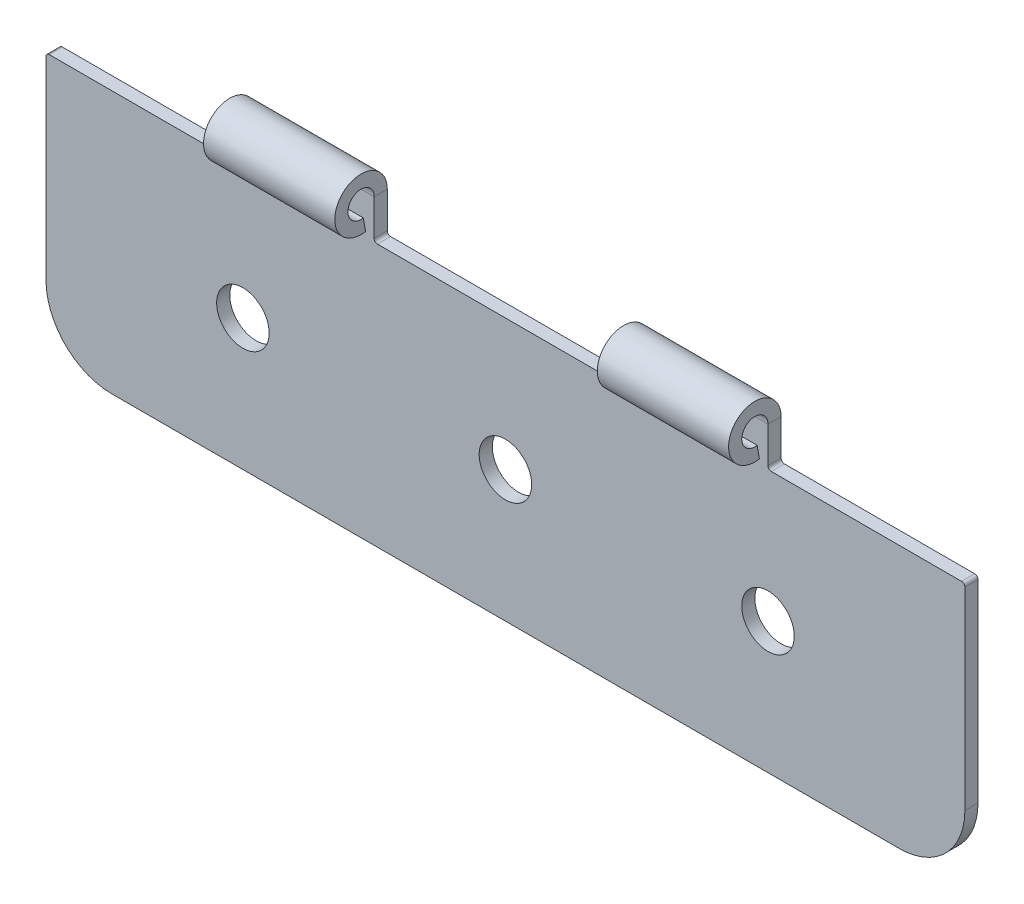
ISO-10303-21;
HEADER;
FILE_DESCRIPTION(('STEP AP214'),'2;1');
FILE_NAME('part.step','',(''),(''),'','','');
FILE_SCHEMA(('AUTOMOTIVE_DESIGN { 1 0 10303 214 1 1 1 1 }'));
ENDSEC;
DATA;
#1=APPLICATION_CONTEXT('core data for automotive mechanical design processes');
#2=APPLICATION_PROTOCOL_DEFINITION('international standard','automotive_design',2000,#1);
#3=PRODUCT_CONTEXT('',#1,'mechanical');
#4=PRODUCT('Part','Part','',(#3));
#5=PRODUCT_RELATED_PRODUCT_CATEGORY('part','',(#4));
#6=PRODUCT_DEFINITION_FORMATION('','',#4);
#7=PRODUCT_DEFINITION_CONTEXT('part definition',#1,'design');
#8=PRODUCT_DEFINITION('design','',#6,#7);
#9=PRODUCT_DEFINITION_SHAPE('','',#8);
#10=(LENGTH_UNIT() NAMED_UNIT(*) SI_UNIT(.MILLI.,.METRE.));
#11=(NAMED_UNIT(*) PLANE_ANGLE_UNIT() SI_UNIT($,.RADIAN.));
#12=(NAMED_UNIT(*) SI_UNIT($,.STERADIAN.) SOLID_ANGLE_UNIT());
#13=UNCERTAINTY_MEASURE_WITH_UNIT(LENGTH_MEASURE(1.E-05),#10,'distance_accuracy_value','');
#14=(GEOMETRIC_REPRESENTATION_CONTEXT(3) GLOBAL_UNCERTAINTY_ASSIGNED_CONTEXT((#13)) GLOBAL_UNIT_ASSIGNED_CONTEXT((#10,
#11,#12)) REPRESENTATION_CONTEXT('',''));
#15=CARTESIAN_POINT('',(0.,0.,0.));
#16=DIRECTION('',(0.,0.,1.));
#17=DIRECTION('',(1.,0.,0.));
#18=AXIS2_PLACEMENT_3D('',#15,#16,#17);
#19=CARTESIAN_POINT('',(0.,0.,-1.));
#20=DIRECTION('',(0.,0.,-1.));
#21=DIRECTION('',(-1.,0.,0.));
#22=AXIS2_PLACEMENT_3D('',#19,#20,#21);
#23=PLANE('',#22);
#24=CARTESIAN_POINT('',(15.,10.,-1.));
#25=DIRECTION('',(0.,0.,1.));
#26=DIRECTION('',(1.,0.,0.));
#27=AXIS2_PLACEMENT_3D('',#24,#25,#26);
#28=CIRCLE('',#27,2.);
#29=CARTESIAN_POINT('',(17.,10.,-1.));
#30=VERTEX_POINT('',#29);
#31=EDGE_CURVE('E820',#30,#30,#28,.T.);
#32=ORIENTED_EDGE('',*,*,#31,.T.);
#33=EDGE_LOOP('',(#32));
#34=FACE_BOUND('',#33,.T.);
#35=CARTESIAN_POINT('',(35.,10.,-1.));
#36=DIRECTION('',(0.,0.,1.));
#37=DIRECTION('',(1.,0.,0.));
#38=AXIS2_PLACEMENT_3D('',#35,#36,#37);
#39=CIRCLE('',#38,2.);
#40=CARTESIAN_POINT('',(37.,10.,-1.));
#41=VERTEX_POINT('',#40);
#42=EDGE_CURVE('E813',#41,#41,#39,.T.);
#43=ORIENTED_EDGE('',*,*,#42,.T.);
#44=EDGE_LOOP('',(#43));
#45=FACE_BOUND('',#44,.T.);
#46=DIRECTION('',(-1.,0.,0.));
#47=VECTOR('',#46,1.);
#48=CARTESIAN_POINT('',(55.,20.,-1.));
#49=LINE('',#48,#47);
#50=CARTESIAN_POINT('',(69.75,20.,-1.));
#51=VERTEX_POINT('',#50);
#52=CARTESIAN_POINT('',(55.25,20.,-1.));
#53=VERTEX_POINT('',#52);
#54=EDGE_CURVE('E204',#51,#53,#49,.T.);
#55=ORIENTED_EDGE('',*,*,#54,.F.);
#56=CARTESIAN_POINT('',(69.75,19.75,-1.));
#57=DIRECTION('',(0.,0.,-1.));
#58=DIRECTION('',(-1.,0.,0.));
#59=AXIS2_PLACEMENT_3D('',#56,#57,#58);
#60=CIRCLE('',#59,0.25);
#61=CARTESIAN_POINT('',(70.,19.75,-1.));
#62=VERTEX_POINT('',#61);
#63=EDGE_CURVE('E365',#51,#62,#60,.T.);
#64=ORIENTED_EDGE('',*,*,#63,.T.);
#65=DIRECTION('',(0.,1.,0.));
#66=VECTOR('',#65,1.);
#67=CARTESIAN_POINT('',(70.,20.,-1.));
#68=LINE('',#67,#66);
#69=CARTESIAN_POINT('',(70.,5.,-1.));
#70=VERTEX_POINT('',#69);
#71=EDGE_CURVE('E287',#70,#62,#68,.T.);
#72=ORIENTED_EDGE('',*,*,#71,.F.);
#73=CARTESIAN_POINT('',(65.,5.,-1.));
#74=DIRECTION('',(0.,0.,-1.));
#75=DIRECTION('',(-1.,0.,0.));
#76=AXIS2_PLACEMENT_3D('',#73,#74,#75);
#77=CIRCLE('',#76,5.);
#78=CARTESIAN_POINT('',(65.,0.,-1.));
#79=VERTEX_POINT('',#78);
#80=EDGE_CURVE('E344',#70,#79,#77,.T.);
#81=ORIENTED_EDGE('',*,*,#80,.T.);
#82=DIRECTION('',(1.,0.,0.));
#83=VECTOR('',#82,1.);
#84=CARTESIAN_POINT('',(70.,0.,-1.));
#85=LINE('',#84,#83);
#86=CARTESIAN_POINT('',(5.,0.,-1.));
#87=VERTEX_POINT('',#86);
#88=EDGE_CURVE('E284',#87,#79,#85,.T.);
#89=ORIENTED_EDGE('',*,*,#88,.F.);
#90=CARTESIAN_POINT('',(5.,5.,-1.));
#91=DIRECTION('',(0.,0.,-1.));
#92=DIRECTION('',(-1.,0.,0.));
#93=AXIS2_PLACEMENT_3D('',#90,#91,#92);
#94=CIRCLE('',#93,5.);
#95=CARTESIAN_POINT('',(0.,5.,-1.));
#96=VERTEX_POINT('',#95);
#97=EDGE_CURVE('E346',#87,#96,#94,.T.);
#98=ORIENTED_EDGE('',*,*,#97,.T.);
#99=DIRECTION('',(0.,-1.,0.));
#100=VECTOR('',#99,1.);
#101=CARTESIAN_POINT('',(0.,0.,-1.));
#102=LINE('',#101,#100);
#103=CARTESIAN_POINT('',(0.,19.75,-1.));
#104=VERTEX_POINT('',#103);
#105=EDGE_CURVE('E305',#104,#96,#102,.T.);
#106=ORIENTED_EDGE('',*,*,#105,.F.);
#107=CARTESIAN_POINT('',(0.25,19.75,-1.));
#108=DIRECTION('',(0.,0.,-1.));
#109=DIRECTION('',(-1.,0.,0.));
#110=AXIS2_PLACEMENT_3D('',#107,#108,#109);
#111=CIRCLE('',#110,0.25);
#112=CARTESIAN_POINT('',(0.25,20.,-1.));
#113=VERTEX_POINT('',#112);
#114=EDGE_CURVE('E363',#104,#113,#111,.T.);
#115=ORIENTED_EDGE('',*,*,#114,.T.);
#116=DIRECTION('',(-1.,0.,0.));
#117=VECTOR('',#116,1.);
#118=CARTESIAN_POINT('',(0.,20.,-1.));
#119=LINE('',#118,#117);
#120=CARTESIAN_POINT('',(14.75,20.,-1.));
#121=VERTEX_POINT('',#120);
#122=EDGE_CURVE('E302',#121,#113,#119,.T.);
#123=ORIENTED_EDGE('',*,*,#122,.F.);
#124=CARTESIAN_POINT('',(14.75,20.25,-1.));
#125=DIRECTION('',(0.,0.,-1.));
#126=DIRECTION('',(-1.,0.,0.));
#127=AXIS2_PLACEMENT_3D('',#124,#125,#126);
#128=CIRCLE('',#127,0.25);
#129=CARTESIAN_POINT('',(15.,20.25,-1.));
#130=VERTEX_POINT('',#129);
#131=EDGE_CURVE('E11',#121,#130,#128,.F.);
#132=ORIENTED_EDGE('',*,*,#131,.T.);
#133=DIRECTION('',(0.,-1.,0.));
#134=VECTOR('',#133,1.);
#135=CARTESIAN_POINT('',(15.,20.,-1.));
#136=LINE('',#135,#134);
#137=CARTESIAN_POINT('',(15.,23.,-1.));
#138=VERTEX_POINT('',#137);
#139=EDGE_CURVE('E299',#138,#130,#136,.T.);
#140=ORIENTED_EDGE('',*,*,#139,.F.);
#141=DIRECTION('',(-1.,0.,0.));
#142=VECTOR('',#141,1.);
#143=CARTESIAN_POINT('',(15.,23.,-1.));
#144=LINE('',#143,#142);
#145=CARTESIAN_POINT('',(25.,23.,-1.));
#146=VERTEX_POINT('',#145);
#147=EDGE_CURVE('E251',#138,#146,#144,.F.);
#148=ORIENTED_EDGE('',*,*,#147,.T.);
#149=DIRECTION('',(0.,1.,0.));
#150=VECTOR('',#149,1.);
#151=CARTESIAN_POINT('',(25.,25.,-1.));
#152=LINE('',#151,#150);
#153=CARTESIAN_POINT('',(25.,20.25,-1.));
#154=VERTEX_POINT('',#153);
#155=EDGE_CURVE('E297',#154,#146,#152,.T.);
#156=ORIENTED_EDGE('',*,*,#155,.F.);
#157=CARTESIAN_POINT('',(25.25,20.25,-1.));
#158=DIRECTION('',(0.,0.,-1.));
#159=DIRECTION('',(-1.,0.,0.));
#160=AXIS2_PLACEMENT_3D('',#157,#158,#159);
#161=CIRCLE('',#160,0.25);
#162=CARTESIAN_POINT('',(25.25,20.,-1.));
#163=VERTEX_POINT('',#162);
#164=EDGE_CURVE('E394',#154,#163,#161,.F.);
#165=ORIENTED_EDGE('',*,*,#164,.T.);
#166=DIRECTION('',(-1.,0.,0.));
#167=VECTOR('',#166,1.);
#168=CARTESIAN_POINT('',(25.,20.,-1.));
#169=LINE('',#168,#167);
#170=CARTESIAN_POINT('',(44.75,20.,-1.));
#171=VERTEX_POINT('',#170);
#172=EDGE_CURVE('E294',#171,#163,#169,.T.);
#173=ORIENTED_EDGE('',*,*,#172,.F.);
#174=CARTESIAN_POINT('',(44.75,20.25,-1.));
#175=DIRECTION('',(0.,0.,-1.));
#176=DIRECTION('',(-1.,0.,0.));
#177=AXIS2_PLACEMENT_3D('',#174,#175,#176);
#178=CIRCLE('',#177,0.25);
#179=CARTESIAN_POINT('',(45.,20.25,-1.));
#180=VERTEX_POINT('',#179);
#181=EDGE_CURVE('E59',#171,#180,#178,.F.);
#182=ORIENTED_EDGE('',*,*,#181,.T.);
#183=DIRECTION('',(0.,-1.,0.));
#184=VECTOR('',#183,1.);
#185=CARTESIAN_POINT('',(45.,20.,-1.));
#186=LINE('',#185,#184);
#187=CARTESIAN_POINT('',(45.,23.,-1.));
#188=VERTEX_POINT('',#187);
#189=EDGE_CURVE('E203',#188,#180,#186,.T.);
#190=ORIENTED_EDGE('',*,*,#189,.F.);
#191=DIRECTION('',(-1.,0.,0.));
#192=VECTOR('',#191,1.);
#193=CARTESIAN_POINT('',(45.,23.,-1.));
#194=LINE('',#193,#192);
#195=CARTESIAN_POINT('',(55.,23.,-1.));
#196=VERTEX_POINT('',#195);
#197=EDGE_CURVE('E221',#188,#196,#194,.F.);
#198=ORIENTED_EDGE('',*,*,#197,.T.);
#199=DIRECTION('',(0.,1.,0.));
#200=VECTOR('',#199,1.);
#201=CARTESIAN_POINT('',(55.,25.,-1.));
#202=LINE('',#201,#200);
#203=CARTESIAN_POINT('',(55.,20.25,-1.));
#204=VERTEX_POINT('',#203);
#205=EDGE_CURVE('E197',#204,#196,#202,.T.);
#206=ORIENTED_EDGE('',*,*,#205,.F.);
#207=CARTESIAN_POINT('',(55.25,20.25,-1.));
#208=DIRECTION('',(0.,0.,-1.));
#209=DIRECTION('',(-1.,0.,0.));
#210=AXIS2_PLACEMENT_3D('',#207,#208,#209);
#211=CIRCLE('',#210,0.25);
#212=EDGE_CURVE('E390',#204,#53,#211,.F.);
#213=ORIENTED_EDGE('',*,*,#212,.T.);
#214=EDGE_LOOP('',(#55,#64,#72,#81,#89,#98,#106,#115,#123,#132,#140,#148,#156,#165,#173,#182,
#190,#198,#206,#213));
#215=FACE_BOUND('',#214,.T.);
#216=CARTESIAN_POINT('',(55.,10.,-1.));
#217=DIRECTION('',(0.,0.,1.));
#218=DIRECTION('',(1.,0.,0.));
#219=AXIS2_PLACEMENT_3D('',#216,#217,#218);
#220=CIRCLE('',#219,2.);
#221=CARTESIAN_POINT('',(57.,10.,-1.));
#222=VERTEX_POINT('',#221);
#223=EDGE_CURVE('E232',#222,#222,#220,.T.);
#224=ORIENTED_EDGE('',*,*,#223,.T.);
#225=EDGE_LOOP('',(#224));
#226=FACE_BOUND('',#225,.T.);
#227=ADVANCED_FACE('F36',(#34,#45,#215,#226),#23,.T.);
#228=CARTESIAN_POINT('',(45.,20.,-1.));
#229=DIRECTION('',(-1.,0.,0.));
#230=DIRECTION('',(0.,0.,1.));
#231=AXIS2_PLACEMENT_3D('',#228,#229,#230);
#232=PLANE('',#231);
#233=ORIENTED_EDGE('',*,*,#189,.T.);
#234=DIRECTION('',(0.,0.,1.));
#235=VECTOR('',#234,1.);
#236=CARTESIAN_POINT('',(45.,20.25,0.));
#237=LINE('',#236,#235);
#238=CARTESIAN_POINT('',(45.,20.25,0.));
#239=VERTEX_POINT('',#238);
#240=EDGE_CURVE('E375',#180,#239,#237,.T.);
#241=ORIENTED_EDGE('',*,*,#240,.T.);
#242=DIRECTION('',(0.,-1.,0.));
#243=VECTOR('',#242,1.);
#244=CARTESIAN_POINT('',(45.,20.,0.));
#245=LINE('',#244,#243);
#246=CARTESIAN_POINT('',(45.,23.,0.));
#247=VERTEX_POINT('',#246);
#248=EDGE_CURVE('E318',#247,#239,#245,.T.);
#249=ORIENTED_EDGE('',*,*,#248,.F.);
#250=DIRECTION('',(0.,0.,-1.));
#251=VECTOR('',#250,1.);
#252=CARTESIAN_POINT('',(45.,23.,0.));
#253=LINE('',#252,#251);
#254=EDGE_CURVE('E215',#247,#188,#253,.T.);
#255=ORIENTED_EDGE('',*,*,#254,.T.);
#256=EDGE_LOOP('',(#233,#241,#249,#255));
#257=FACE_BOUND('',#256,.T.);
#258=ADVANCED_FACE('F447',(#257),#232,.T.);
#259=CARTESIAN_POINT('',(15.,20.,-1.));
#260=DIRECTION('',(-1.,0.,0.));
#261=DIRECTION('',(0.,0.,1.));
#262=AXIS2_PLACEMENT_3D('',#259,#260,#261);
#263=PLANE('',#262);
#264=ORIENTED_EDGE('',*,*,#139,.T.);
#265=DIRECTION('',(0.,0.,1.));
#266=VECTOR('',#265,1.);
#267=CARTESIAN_POINT('',(15.,20.25,0.));
#268=LINE('',#267,#266);
#269=CARTESIAN_POINT('',(15.,20.25,0.));
#270=VERTEX_POINT('',#269);
#271=EDGE_CURVE('E378',#130,#270,#268,.T.);
#272=ORIENTED_EDGE('',*,*,#271,.T.);
#273=DIRECTION('',(0.,-1.,0.));
#274=VECTOR('',#273,1.);
#275=CARTESIAN_POINT('',(15.,20.,0.));
#276=LINE('',#275,#274);
#277=CARTESIAN_POINT('',(15.,23.,0.));
#278=VERTEX_POINT('',#277);
#279=EDGE_CURVE('E326',#278,#270,#276,.T.);
#280=ORIENTED_EDGE('',*,*,#279,.F.);
#281=DIRECTION('',(0.,0.,-1.));
#282=VECTOR('',#281,1.);
#283=CARTESIAN_POINT('',(15.,23.,0.));
#284=LINE('',#283,#282);
#285=EDGE_CURVE('E258',#278,#138,#284,.T.);
#286=ORIENTED_EDGE('',*,*,#285,.T.);
#287=EDGE_LOOP('',(#264,#272,#280,#286));
#288=FACE_BOUND('',#287,.T.);
#289=ADVANCED_FACE('F414',(#288),#263,.T.);
#290=CARTESIAN_POINT('',(70.,0.,-1.));
#291=DIRECTION('',(0.,-1.,0.));
#292=DIRECTION('',(1.,0.,0.));
#293=AXIS2_PLACEMENT_3D('',#290,#291,#292);
#294=PLANE('',#293);
#295=DIRECTION('',(1.,0.,0.));
#296=VECTOR('',#295,1.);
#297=CARTESIAN_POINT('',(70.,0.,0.));
#298=LINE('',#297,#296);
#299=CARTESIAN_POINT('',(5.,0.,0.));
#300=VERTEX_POINT('',#299);
#301=CARTESIAN_POINT('',(65.,0.,0.));
#302=VERTEX_POINT('',#301);
#303=EDGE_CURVE('E281',#300,#302,#298,.T.);
#304=ORIENTED_EDGE('',*,*,#303,.F.);
#305=DIRECTION('',(0.,0.,1.));
#306=VECTOR('',#305,1.);
#307=CARTESIAN_POINT('',(5.,0.,-1.));
#308=LINE('',#307,#306);
#309=EDGE_CURVE('E342',#300,#87,#308,.F.);
#310=ORIENTED_EDGE('',*,*,#309,.T.);
#311=ORIENTED_EDGE('',*,*,#88,.T.);
#312=DIRECTION('',(0.,0.,1.));
#313=VECTOR('',#312,1.);
#314=CARTESIAN_POINT('',(65.,0.,-1.));
#315=LINE('',#314,#313);
#316=EDGE_CURVE('E339',#79,#302,#315,.T.);
#317=ORIENTED_EDGE('',*,*,#316,.T.);
#318=EDGE_LOOP('',(#304,#310,#311,#317));
#319=FACE_BOUND('',#318,.T.);
#320=ADVANCED_FACE('F487',(#319),#294,.T.);
#321=CARTESIAN_POINT('',(0.,0.,-1.));
#322=DIRECTION('',(-1.,0.,0.));
#323=DIRECTION('',(0.,0.,1.));
#324=AXIS2_PLACEMENT_3D('',#321,#322,#323);
#325=PLANE('',#324);
#326=DIRECTION('',(0.,-1.,0.));
#327=VECTOR('',#326,1.);
#328=CARTESIAN_POINT('',(0.,0.,0.));
#329=LINE('',#328,#327);
#330=CARTESIAN_POINT('',(0.,19.75,0.));
#331=VERTEX_POINT('',#330);
#332=CARTESIAN_POINT('',(0.,5.,0.));
#333=VERTEX_POINT('',#332);
#334=EDGE_CURVE('E288',#331,#333,#329,.T.);
#335=ORIENTED_EDGE('',*,*,#334,.F.);
#336=DIRECTION('',(0.,0.,1.));
#337=VECTOR('',#336,1.);
#338=CARTESIAN_POINT('',(0.,19.75,-1.));
#339=LINE('',#338,#337);
#340=EDGE_CURVE('E386',#331,#104,#339,.F.);
#341=ORIENTED_EDGE('',*,*,#340,.T.);
#342=ORIENTED_EDGE('',*,*,#105,.T.);
#343=DIRECTION('',(0.,0.,1.));
#344=VECTOR('',#343,1.);
#345=CARTESIAN_POINT('',(0.,5.,-1.));
#346=LINE('',#345,#344);
#347=EDGE_CURVE('E307',#96,#333,#346,.T.);
#348=ORIENTED_EDGE('',*,*,#347,.T.);
#349=EDGE_LOOP('',(#335,#341,#342,#348));
#350=FACE_BOUND('',#349,.T.);
#351=ADVANCED_FACE('F484',(#350),#325,.T.);
#352=CARTESIAN_POINT('',(0.,20.,-1.));
#353=DIRECTION('',(0.,1.,0.));
#354=DIRECTION('',(0.,0.,1.));
#355=AXIS2_PLACEMENT_3D('',#352,#353,#354);
#356=PLANE('',#355);
#357=DIRECTION('',(-1.,0.,0.));
#358=VECTOR('',#357,1.);
#359=CARTESIAN_POINT('',(0.,20.,0.));
#360=LINE('',#359,#358);
#361=CARTESIAN_POINT('',(14.75,20.,0.));
#362=VERTEX_POINT('',#361);
#363=CARTESIAN_POINT('',(0.25,20.,0.));
#364=VERTEX_POINT('',#363);
#365=EDGE_CURVE('E329',#362,#364,#360,.T.);
#366=ORIENTED_EDGE('',*,*,#365,.F.);
#367=DIRECTION('',(0.,0.,1.));
#368=VECTOR('',#367,1.);
#369=CARTESIAN_POINT('',(14.75,20.,-1.));
#370=LINE('',#369,#368);
#371=EDGE_CURVE('E384',#362,#121,#370,.F.);
#372=ORIENTED_EDGE('',*,*,#371,.T.);
#373=ORIENTED_EDGE('',*,*,#122,.T.);
#374=DIRECTION('',(0.,0.,1.));
#375=VECTOR('',#374,1.);
#376=CARTESIAN_POINT('',(0.25,20.,-1.));
#377=LINE('',#376,#375);
#378=EDGE_CURVE('E381',#113,#364,#377,.T.);
#379=ORIENTED_EDGE('',*,*,#378,.T.);
#380=EDGE_LOOP('',(#366,#372,#373,#379));
#381=FACE_BOUND('',#380,.T.);
#382=ADVANCED_FACE('F407',(#381),#356,.T.);
#383=CARTESIAN_POINT('',(25.,25.,-1.));
#384=DIRECTION('',(1.,0.,0.));
#385=DIRECTION('',(0.,0.,-1.));
#386=AXIS2_PLACEMENT_3D('',#383,#384,#385);
#387=PLANE('',#386);
#388=DIRECTION('',(0.,1.,0.));
#389=VECTOR('',#388,1.);
#390=CARTESIAN_POINT('',(25.,25.,0.));
#391=LINE('',#390,#389);
#392=CARTESIAN_POINT('',(25.,20.25,0.));
#393=VERTEX_POINT('',#392);
#394=CARTESIAN_POINT('',(25.,23.,0.));
#395=VERTEX_POINT('',#394);
#396=EDGE_CURVE('E324',#393,#395,#391,.T.);
#397=ORIENTED_EDGE('',*,*,#396,.F.);
#398=DIRECTION('',(0.,0.,1.));
#399=VECTOR('',#398,1.);
#400=CARTESIAN_POINT('',(25.,20.25,-1.));
#401=LINE('',#400,#399);
#402=EDGE_CURVE('E373',#393,#154,#401,.F.);
#403=ORIENTED_EDGE('',*,*,#402,.T.);
#404=ORIENTED_EDGE('',*,*,#155,.T.);
#405=DIRECTION('',(0.,0.,-1.));
#406=VECTOR('',#405,1.);
#407=CARTESIAN_POINT('',(25.,23.,0.));
#408=LINE('',#407,#406);
#409=EDGE_CURVE('E274',#395,#146,#408,.T.);
#410=ORIENTED_EDGE('',*,*,#409,.F.);
#411=EDGE_LOOP('',(#397,#403,#404,#410));
#412=FACE_BOUND('',#411,.T.);
#413=ADVANCED_FACE('F430',(#412),#387,.T.);
#414=CARTESIAN_POINT('',(25.,20.,-1.));
#415=DIRECTION('',(0.,1.,0.));
#416=DIRECTION('',(0.,0.,1.));
#417=AXIS2_PLACEMENT_3D('',#414,#415,#416);
#418=PLANE('',#417);
#419=ORIENTED_EDGE('',*,*,#172,.T.);
#420=DIRECTION('',(0.,0.,1.));
#421=VECTOR('',#420,1.);
#422=CARTESIAN_POINT('',(25.25,20.,0.));
#423=LINE('',#422,#421);
#424=CARTESIAN_POINT('',(25.25,20.,0.));
#425=VERTEX_POINT('',#424);
#426=EDGE_CURVE('E370',#163,#425,#423,.T.);
#427=ORIENTED_EDGE('',*,*,#426,.T.);
#428=DIRECTION('',(-1.,0.,0.));
#429=VECTOR('',#428,1.);
#430=CARTESIAN_POINT('',(25.,20.,0.));
#431=LINE('',#430,#429);
#432=CARTESIAN_POINT('',(44.75,20.,0.));
#433=VERTEX_POINT('',#432);
#434=EDGE_CURVE('E321',#433,#425,#431,.T.);
#435=ORIENTED_EDGE('',*,*,#434,.F.);
#436=DIRECTION('',(0.,0.,1.));
#437=VECTOR('',#436,1.);
#438=CARTESIAN_POINT('',(44.75,20.,-1.));
#439=LINE('',#438,#437);
#440=EDGE_CURVE('E368',#433,#171,#439,.F.);
#441=ORIENTED_EDGE('',*,*,#440,.T.);
#442=EDGE_LOOP('',(#419,#427,#435,#441));
#443=FACE_BOUND('',#442,.T.);
#444=ADVANCED_FACE('F439',(#443),#418,.T.);
#445=CARTESIAN_POINT('',(55.,25.,-1.));
#446=DIRECTION('',(1.,0.,0.));
#447=DIRECTION('',(0.,0.,-1.));
#448=AXIS2_PLACEMENT_3D('',#445,#446,#447);
#449=PLANE('',#448);
#450=DIRECTION('',(0.,1.,0.));
#451=VECTOR('',#450,1.);
#452=CARTESIAN_POINT('',(55.,25.,0.));
#453=LINE('',#452,#451);
#454=CARTESIAN_POINT('',(55.,20.25,0.));
#455=VERTEX_POINT('',#454);
#456=CARTESIAN_POINT('',(55.,23.,0.));
#457=VERTEX_POINT('',#456);
#458=EDGE_CURVE('E316',#455,#457,#453,.T.);
#459=ORIENTED_EDGE('',*,*,#458,.F.);
#460=DIRECTION('',(0.,0.,1.));
#461=VECTOR('',#460,1.);
#462=CARTESIAN_POINT('',(55.,20.25,-1.));
#463=LINE('',#462,#461);
#464=EDGE_CURVE('E51',#455,#204,#463,.F.);
#465=ORIENTED_EDGE('',*,*,#464,.T.);
#466=ORIENTED_EDGE('',*,*,#205,.T.);
#467=DIRECTION('',(0.,0.,-1.));
#468=VECTOR('',#467,1.);
#469=CARTESIAN_POINT('',(55.,23.,0.));
#470=LINE('',#469,#468);
#471=EDGE_CURVE('E200',#457,#196,#470,.T.);
#472=ORIENTED_EDGE('',*,*,#471,.F.);
#473=EDGE_LOOP('',(#459,#465,#466,#472));
#474=FACE_BOUND('',#473,.T.);
#475=ADVANCED_FACE('F199',(#474),#449,.T.);
#476=CARTESIAN_POINT('',(55.,20.,-1.));
#477=DIRECTION('',(0.,1.,0.));
#478=DIRECTION('',(-1.,0.,0.));
#479=AXIS2_PLACEMENT_3D('',#476,#477,#478);
#480=PLANE('',#479);
#481=DIRECTION('',(-1.,0.,0.));
#482=VECTOR('',#481,1.);
#483=CARTESIAN_POINT('',(55.,20.,0.));
#484=LINE('',#483,#482);
#485=CARTESIAN_POINT('',(69.75,20.,0.));
#486=VERTEX_POINT('',#485);
#487=CARTESIAN_POINT('',(55.25,20.,0.));
#488=VERTEX_POINT('',#487);
#489=EDGE_CURVE('E313',#486,#488,#484,.T.);
#490=ORIENTED_EDGE('',*,*,#489,.F.);
#491=DIRECTION('',(0.,0.,1.));
#492=VECTOR('',#491,1.);
#493=CARTESIAN_POINT('',(69.75,20.,-1.));
#494=LINE('',#493,#492);
#495=EDGE_CURVE('E361',#486,#51,#494,.F.);
#496=ORIENTED_EDGE('',*,*,#495,.T.);
#497=ORIENTED_EDGE('',*,*,#54,.T.);
#498=DIRECTION('',(0.,0.,1.));
#499=VECTOR('',#498,1.);
#500=CARTESIAN_POINT('',(55.25,20.,0.));
#501=LINE('',#500,#499);
#502=EDGE_CURVE('E358',#53,#488,#501,.T.);
#503=ORIENTED_EDGE('',*,*,#502,.T.);
#504=EDGE_LOOP('',(#490,#496,#497,#503));
#505=FACE_BOUND('',#504,.T.);
#506=ADVANCED_FACE('F499',(#505),#480,.T.);
#507=CARTESIAN_POINT('',(70.,20.,-1.));
#508=DIRECTION('',(1.,0.,0.));
#509=DIRECTION('',(0.,0.,-1.));
#510=AXIS2_PLACEMENT_3D('',#507,#508,#509);
#511=PLANE('',#510);
#512=ORIENTED_EDGE('',*,*,#71,.T.);
#513=DIRECTION('',(0.,0.,1.));
#514=VECTOR('',#513,1.);
#515=CARTESIAN_POINT('',(70.,19.75,-1.));
#516=LINE('',#515,#514);
#517=CARTESIAN_POINT('',(70.,19.75,0.));
#518=VERTEX_POINT('',#517);
#519=EDGE_CURVE('E351',#62,#518,#516,.T.);
#520=ORIENTED_EDGE('',*,*,#519,.T.);
#521=DIRECTION('',(0.,1.,0.));
#522=VECTOR('',#521,1.);
#523=CARTESIAN_POINT('',(70.,20.,0.));
#524=LINE('',#523,#522);
#525=CARTESIAN_POINT('',(70.,5.,0.));
#526=VERTEX_POINT('',#525);
#527=EDGE_CURVE('E310',#526,#518,#524,.T.);
#528=ORIENTED_EDGE('',*,*,#527,.F.);
#529=DIRECTION('',(0.,0.,1.));
#530=VECTOR('',#529,1.);
#531=CARTESIAN_POINT('',(70.,5.,-1.));
#532=LINE('',#531,#530);
#533=EDGE_CURVE('E349',#526,#70,#532,.F.);
#534=ORIENTED_EDGE('',*,*,#533,.T.);
#535=EDGE_LOOP('',(#512,#520,#528,#534));
#536=FACE_BOUND('',#535,.T.);
#537=ADVANCED_FACE('F482',(#536),#511,.T.);
#538=CARTESIAN_POINT('',(0.,0.,0.));
#539=DIRECTION('',(0.,0.,-1.));
#540=DIRECTION('',(-1.,0.,0.));
#541=AXIS2_PLACEMENT_3D('',#538,#539,#540);
#542=PLANE('',#541);
#543=CARTESIAN_POINT('',(15.,10.,0.));
#544=DIRECTION('',(0.,0.,1.));
#545=DIRECTION('',(1.,0.,0.));
#546=AXIS2_PLACEMENT_3D('',#543,#544,#545);
#547=CIRCLE('',#546,2.);
#548=CARTESIAN_POINT('',(17.,10.,0.));
#549=VERTEX_POINT('',#548);
#550=EDGE_CURVE('E822',#549,#549,#547,.T.);
#551=ORIENTED_EDGE('',*,*,#550,.F.);
#552=EDGE_LOOP('',(#551));
#553=FACE_BOUND('',#552,.T.);
#554=CARTESIAN_POINT('',(35.,10.,0.));
#555=DIRECTION('',(0.,0.,1.));
#556=DIRECTION('',(1.,0.,0.));
#557=AXIS2_PLACEMENT_3D('',#554,#555,#556);
#558=CIRCLE('',#557,2.);
#559=CARTESIAN_POINT('',(37.,10.,0.));
#560=VERTEX_POINT('',#559);
#561=EDGE_CURVE('E815',#560,#560,#558,.T.);
#562=ORIENTED_EDGE('',*,*,#561,.F.);
#563=EDGE_LOOP('',(#562));
#564=FACE_BOUND('',#563,.T.);
#565=CARTESIAN_POINT('',(55.,10.,0.));
#566=DIRECTION('',(0.,0.,1.));
#567=DIRECTION('',(1.,0.,0.));
#568=AXIS2_PLACEMENT_3D('',#565,#566,#567);
#569=CIRCLE('',#568,2.);
#570=CARTESIAN_POINT('',(57.,10.,0.));
#571=VERTEX_POINT('',#570);
#572=EDGE_CURVE('E811',#571,#571,#569,.T.);
#573=ORIENTED_EDGE('',*,*,#572,.F.);
#574=EDGE_LOOP('',(#573));
#575=FACE_BOUND('',#574,.T.);
#576=ORIENTED_EDGE('',*,*,#527,.T.);
#577=CARTESIAN_POINT('',(69.75,19.75,0.));
#578=DIRECTION('',(0.,0.,-1.));
#579=DIRECTION('',(-1.,0.,0.));
#580=AXIS2_PLACEMENT_3D('',#577,#578,#579);
#581=CIRCLE('',#580,0.25);
#582=EDGE_CURVE('E356',#518,#486,#581,.F.);
#583=ORIENTED_EDGE('',*,*,#582,.T.);
#584=ORIENTED_EDGE('',*,*,#489,.T.);
#585=CARTESIAN_POINT('',(55.25,20.25,0.));
#586=DIRECTION('',(0.,0.,-1.));
#587=DIRECTION('',(-1.,0.,0.));
#588=AXIS2_PLACEMENT_3D('',#585,#586,#587);
#589=CIRCLE('',#588,0.25);
#590=EDGE_CURVE('E388',#488,#455,#589,.T.);
#591=ORIENTED_EDGE('',*,*,#590,.T.);
#592=ORIENTED_EDGE('',*,*,#458,.T.);
#593=DIRECTION('',(-1.,0.,0.));
#594=VECTOR('',#593,1.);
#595=CARTESIAN_POINT('',(45.,23.,0.));
#596=LINE('',#595,#594);
#597=EDGE_CURVE('E237',#247,#457,#596,.F.);
#598=ORIENTED_EDGE('',*,*,#597,.F.);
#599=ORIENTED_EDGE('',*,*,#248,.T.);
#600=CARTESIAN_POINT('',(44.75,20.25,0.));
#601=DIRECTION('',(0.,0.,-1.));
#602=DIRECTION('',(-1.,0.,0.));
#603=AXIS2_PLACEMENT_3D('',#600,#601,#602);
#604=CIRCLE('',#603,0.25);
#605=EDGE_CURVE('E396',#239,#433,#604,.T.);
#606=ORIENTED_EDGE('',*,*,#605,.T.);
#607=ORIENTED_EDGE('',*,*,#434,.T.);
#608=CARTESIAN_POINT('',(25.25,20.25,0.));
#609=DIRECTION('',(0.,0.,-1.));
#610=DIRECTION('',(-1.,0.,0.));
#611=AXIS2_PLACEMENT_3D('',#608,#609,#610);
#612=CIRCLE('',#611,0.25);
#613=EDGE_CURVE('E392',#425,#393,#612,.T.);
#614=ORIENTED_EDGE('',*,*,#613,.T.);
#615=ORIENTED_EDGE('',*,*,#396,.T.);
#616=DIRECTION('',(-1.,0.,0.));
#617=VECTOR('',#616,1.);
#618=CARTESIAN_POINT('',(15.,23.,0.));
#619=LINE('',#618,#617);
#620=EDGE_CURVE('E267',#278,#395,#619,.F.);
#621=ORIENTED_EDGE('',*,*,#620,.F.);
#622=ORIENTED_EDGE('',*,*,#279,.T.);
#623=CARTESIAN_POINT('',(14.75,20.25,0.));
#624=DIRECTION('',(0.,0.,-1.));
#625=DIRECTION('',(-1.,0.,0.));
#626=AXIS2_PLACEMENT_3D('',#623,#624,#625);
#627=CIRCLE('',#626,0.25);
#628=EDGE_CURVE('E44',#270,#362,#627,.T.);
#629=ORIENTED_EDGE('',*,*,#628,.T.);
#630=ORIENTED_EDGE('',*,*,#365,.T.);
#631=CARTESIAN_POINT('',(0.25,19.75,0.));
#632=DIRECTION('',(0.,0.,-1.));
#633=DIRECTION('',(-1.,0.,0.));
#634=AXIS2_PLACEMENT_3D('',#631,#632,#633);
#635=CIRCLE('',#634,0.25);
#636=EDGE_CURVE('E354',#364,#331,#635,.F.);
#637=ORIENTED_EDGE('',*,*,#636,.T.);
#638=ORIENTED_EDGE('',*,*,#334,.T.);
#639=CARTESIAN_POINT('',(5.,5.,0.));
#640=DIRECTION('',(0.,0.,-1.));
#641=DIRECTION('',(-1.,0.,0.));
#642=AXIS2_PLACEMENT_3D('',#639,#640,#641);
#643=CIRCLE('',#642,5.);
#644=EDGE_CURVE('E337',#333,#300,#643,.F.);
#645=ORIENTED_EDGE('',*,*,#644,.T.);
#646=ORIENTED_EDGE('',*,*,#303,.T.);
#647=CARTESIAN_POINT('',(65.,5.,0.));
#648=DIRECTION('',(0.,0.,-1.));
#649=DIRECTION('',(-1.,0.,0.));
#650=AXIS2_PLACEMENT_3D('',#647,#648,#649);
#651=CIRCLE('',#650,5.);
#652=EDGE_CURVE('E335',#302,#526,#651,.F.);
#653=ORIENTED_EDGE('',*,*,#652,.T.);
#654=EDGE_LOOP('',(#576,#583,#584,#591,#592,#598,#599,#606,#607,#614,#615,#621,#622,#629,#630,
#637,#638,#645,#646,#653));
#655=FACE_BOUND('',#654,.T.);
#656=ADVANCED_FACE('F400',(#553,#564,#575,#655),#542,.F.);
#657=CARTESIAN_POINT('',(20.,22.0151922469878,0.826351822333061));
#658=DIRECTION('',(0.,-0.173648177666938,0.984807753012207));
#659=DIRECTION('',(-1.,0.,0.));
#660=AXIS2_PLACEMENT_3D('',#657,#658,#659);
#661=PLANE('',#660);
#662=DIRECTION('',(0.,-0.984807753012207,-0.173648177666938));
#663=VECTOR('',#662,1.);
#664=CARTESIAN_POINT('',(15.,22.0151922469878,0.826351822333061));
#665=LINE('',#664,#663);
#666=CARTESIAN_POINT('',(15.,22.0151922469878,0.826351822333061));
#667=VERTEX_POINT('',#666);
#668=CARTESIAN_POINT('',(15.,21.0303844939756,0.652703644666123));
#669=VERTEX_POINT('',#668);
#670=EDGE_CURVE('E279',#667,#669,#665,.T.);
#671=ORIENTED_EDGE('',*,*,#670,.F.);
#672=DIRECTION('',(-1.,0.,0.));
#673=VECTOR('',#672,1.);
#674=CARTESIAN_POINT('',(15.,22.0151922469878,0.826351822333061));
#675=LINE('',#674,#673);
#676=CARTESIAN_POINT('',(25.,22.0151922469878,0.826351822333061));
#677=VERTEX_POINT('',#676);
#678=EDGE_CURVE('E248',#677,#667,#675,.T.);
#679=ORIENTED_EDGE('',*,*,#678,.F.);
#680=DIRECTION('',(0.,-0.984807753012207,-0.173648177666938));
#681=VECTOR('',#680,1.);
#682=CARTESIAN_POINT('',(25.,22.0151922469878,0.826351822333061));
#683=LINE('',#682,#681);
#684=CARTESIAN_POINT('',(25.,21.0303844939756,0.652703644666123));
#685=VERTEX_POINT('',#684);
#686=EDGE_CURVE('E277',#677,#685,#683,.T.);
#687=ORIENTED_EDGE('',*,*,#686,.T.);
#688=DIRECTION('',(-1.,0.,0.));
#689=VECTOR('',#688,1.);
#690=CARTESIAN_POINT('',(15.,21.0303844939756,0.652703644666123));
#691=LINE('',#690,#689);
#692=EDGE_CURVE('E259',#685,#669,#691,.T.);
#693=ORIENTED_EDGE('',*,*,#692,.T.);
#694=EDGE_LOOP('',(#671,#679,#687,#693));
#695=FACE_BOUND('',#694,.T.);
#696=ADVANCED_FACE('F481',(#695),#661,.F.);
#697=CARTESIAN_POINT('',(25.,23.,1.));
#698=DIRECTION('',(1.,0.,0.));
#699=DIRECTION('',(0.,0.,-1.));
#700=AXIS2_PLACEMENT_3D('',#697,#698,#699);
#701=PLANE('',#700);
#702=ORIENTED_EDGE('',*,*,#686,.F.);
#703=CARTESIAN_POINT('',(25.,23.,1.));
#704=DIRECTION('',(-1.,0.,0.));
#705=DIRECTION('',(0.,0.,1.));
#706=AXIS2_PLACEMENT_3D('',#703,#704,#705);
#707=CIRCLE('',#706,1.);
#708=EDGE_CURVE('E262',#395,#677,#707,.F.);
#709=ORIENTED_EDGE('',*,*,#708,.F.);
#710=ORIENTED_EDGE('',*,*,#409,.T.);
#711=CARTESIAN_POINT('',(25.,23.,1.));
#712=DIRECTION('',(-1.,0.,0.));
#713=DIRECTION('',(0.,0.,1.));
#714=AXIS2_PLACEMENT_3D('',#711,#712,#713);
#715=CIRCLE('',#714,2.);
#716=EDGE_CURVE('E254',#146,#685,#715,.F.);
#717=ORIENTED_EDGE('',*,*,#716,.T.);
#718=EDGE_LOOP('',(#702,#709,#710,#717));
#719=FACE_BOUND('',#718,.T.);
#720=ADVANCED_FACE('F426',(#719),#701,.T.);
#721=CARTESIAN_POINT('',(15.,23.,1.));
#722=DIRECTION('',(1.,0.,0.));
#723=DIRECTION('',(0.,0.,-1.));
#724=AXIS2_PLACEMENT_3D('',#721,#722,#723);
#725=PLANE('',#724);
#726=CARTESIAN_POINT('',(15.,23.,1.));
#727=DIRECTION('',(-1.,0.,0.));
#728=DIRECTION('',(0.,0.,1.));
#729=AXIS2_PLACEMENT_3D('',#726,#727,#728);
#730=CIRCLE('',#729,1.);
#731=EDGE_CURVE('E270',#667,#278,#730,.T.);
#732=ORIENTED_EDGE('',*,*,#731,.F.);
#733=ORIENTED_EDGE('',*,*,#670,.T.);
#734=CARTESIAN_POINT('',(15.,23.,1.));
#735=DIRECTION('',(-1.,0.,0.));
#736=DIRECTION('',(0.,0.,1.));
#737=AXIS2_PLACEMENT_3D('',#734,#735,#736);
#738=CIRCLE('',#737,2.);
#739=EDGE_CURVE('E255',#669,#138,#738,.T.);
#740=ORIENTED_EDGE('',*,*,#739,.T.);
#741=ORIENTED_EDGE('',*,*,#285,.F.);
#742=EDGE_LOOP('',(#732,#733,#740,#741));
#743=FACE_BOUND('',#742,.T.);
#744=ADVANCED_FACE('F418',(#743),#725,.F.);
#745=CARTESIAN_POINT('',(15.,23.,1.));
#746=DIRECTION('',(-1.,0.,0.));
#747=DIRECTION('',(0.,-0.984807753012207,-0.173648177666938));
#748=AXIS2_PLACEMENT_3D('',#745,#746,#747);
#749=CYLINDRICAL_SURFACE('',#748,2.);
#750=ORIENTED_EDGE('',*,*,#147,.F.);
#751=ORIENTED_EDGE('',*,*,#739,.F.);
#752=ORIENTED_EDGE('',*,*,#692,.F.);
#753=ORIENTED_EDGE('',*,*,#716,.F.);
#754=EDGE_LOOP('',(#750,#751,#752,#753));
#755=FACE_BOUND('',#754,.T.);
#756=ADVANCED_FACE('F464',(#755),#749,.T.);
#757=CARTESIAN_POINT('',(15.,23.,1.));
#758=DIRECTION('',(-1.,0.,0.));
#759=DIRECTION('',(0.,-0.984807753012207,-0.173648177666938));
#760=AXIS2_PLACEMENT_3D('',#757,#758,#759);
#761=CYLINDRICAL_SURFACE('',#760,1.);
#762=ORIENTED_EDGE('',*,*,#620,.T.);
#763=ORIENTED_EDGE('',*,*,#708,.T.);
#764=ORIENTED_EDGE('',*,*,#678,.T.);
#765=ORIENTED_EDGE('',*,*,#731,.T.);
#766=EDGE_LOOP('',(#762,#763,#764,#765));
#767=FACE_BOUND('',#766,.T.);
#768=ADVANCED_FACE('F423',(#767),#761,.F.);
#769=CARTESIAN_POINT('',(50.,22.0151922469878,0.826351822333061));
#770=DIRECTION('',(0.,-0.173648177666938,0.984807753012207));
#771=DIRECTION('',(-1.,0.,0.));
#772=AXIS2_PLACEMENT_3D('',#769,#770,#771);
#773=PLANE('',#772);
#774=DIRECTION('',(0.,-0.984807753012207,-0.173648177666938));
#775=VECTOR('',#774,1.);
#776=CARTESIAN_POINT('',(45.,22.0151922469878,0.826351822333061));
#777=LINE('',#776,#775);
#778=CARTESIAN_POINT('',(45.,22.0151922469878,0.826351822333061));
#779=VERTEX_POINT('',#778);
#780=CARTESIAN_POINT('',(45.,21.0303844939756,0.652703644666123));
#781=VERTEX_POINT('',#780);
#782=EDGE_CURVE('E246',#779,#781,#777,.T.);
#783=ORIENTED_EDGE('',*,*,#782,.F.);
#784=DIRECTION('',(-1.,0.,0.));
#785=VECTOR('',#784,1.);
#786=CARTESIAN_POINT('',(45.,22.0151922469878,0.826351822333061));
#787=LINE('',#786,#785);
#788=CARTESIAN_POINT('',(55.,22.0151922469878,0.826351822333061));
#789=VERTEX_POINT('',#788);
#790=EDGE_CURVE('E242',#789,#779,#787,.T.);
#791=ORIENTED_EDGE('',*,*,#790,.F.);
#792=DIRECTION('',(0.,-0.984807753012207,-0.173648177666938));
#793=VECTOR('',#792,1.);
#794=CARTESIAN_POINT('',(55.,22.0151922469878,0.826351822333061));
#795=LINE('',#794,#793);
#796=CARTESIAN_POINT('',(55.,21.0303844939756,0.652703644666123));
#797=VERTEX_POINT('',#796);
#798=EDGE_CURVE('E214',#789,#797,#795,.T.);
#799=ORIENTED_EDGE('',*,*,#798,.T.);
#800=DIRECTION('',(-1.,0.,0.));
#801=VECTOR('',#800,1.);
#802=CARTESIAN_POINT('',(45.,21.0303844939756,0.652703644666123));
#803=LINE('',#802,#801);
#804=EDGE_CURVE('E224',#797,#781,#803,.T.);
#805=ORIENTED_EDGE('',*,*,#804,.T.);
#806=EDGE_LOOP('',(#783,#791,#799,#805));
#807=FACE_BOUND('',#806,.T.);
#808=ADVANCED_FACE('F456',(#807),#773,.F.);
#809=CARTESIAN_POINT('',(55.,23.,1.));
#810=DIRECTION('',(1.,0.,0.));
#811=DIRECTION('',(0.,0.,-1.));
#812=AXIS2_PLACEMENT_3D('',#809,#810,#811);
#813=PLANE('',#812);
#814=ORIENTED_EDGE('',*,*,#798,.F.);
#815=CARTESIAN_POINT('',(55.,23.,1.));
#816=DIRECTION('',(-1.,0.,0.));
#817=DIRECTION('',(0.,0.,1.));
#818=AXIS2_PLACEMENT_3D('',#815,#816,#817);
#819=CIRCLE('',#818,1.);
#820=EDGE_CURVE('E213',#457,#789,#819,.F.);
#821=ORIENTED_EDGE('',*,*,#820,.F.);
#822=ORIENTED_EDGE('',*,*,#471,.T.);
#823=CARTESIAN_POINT('',(55.,23.,1.));
#824=DIRECTION('',(-1.,0.,0.));
#825=DIRECTION('',(0.,0.,1.));
#826=AXIS2_PLACEMENT_3D('',#823,#824,#825);
#827=CIRCLE('',#826,2.);
#828=EDGE_CURVE('E211',#196,#797,#827,.F.);
#829=ORIENTED_EDGE('',*,*,#828,.T.);
#830=EDGE_LOOP('',(#814,#821,#822,#829));
#831=FACE_BOUND('',#830,.T.);
#832=ADVANCED_FACE('F210',(#831),#813,.T.);
#833=CARTESIAN_POINT('',(45.,23.,1.));
#834=DIRECTION('',(1.,0.,0.));
#835=DIRECTION('',(0.,0.,-1.));
#836=AXIS2_PLACEMENT_3D('',#833,#834,#835);
#837=PLANE('',#836);
#838=CARTESIAN_POINT('',(45.,23.,1.));
#839=DIRECTION('',(-1.,0.,0.));
#840=DIRECTION('',(0.,0.,1.));
#841=AXIS2_PLACEMENT_3D('',#838,#839,#840);
#842=CIRCLE('',#841,1.);
#843=EDGE_CURVE('E240',#779,#247,#842,.T.);
#844=ORIENTED_EDGE('',*,*,#843,.F.);
#845=ORIENTED_EDGE('',*,*,#782,.T.);
#846=CARTESIAN_POINT('',(45.,23.,1.));
#847=DIRECTION('',(-1.,0.,0.));
#848=DIRECTION('',(0.,0.,1.));
#849=AXIS2_PLACEMENT_3D('',#846,#847,#848);
#850=CIRCLE('',#849,2.);
#851=EDGE_CURVE('E228',#781,#188,#850,.T.);
#852=ORIENTED_EDGE('',*,*,#851,.T.);
#853=ORIENTED_EDGE('',*,*,#254,.F.);
#854=EDGE_LOOP('',(#844,#845,#852,#853));
#855=FACE_BOUND('',#854,.T.);
#856=ADVANCED_FACE('F451',(#855),#837,.F.);
#857=CARTESIAN_POINT('',(45.,23.,1.));
#858=DIRECTION('',(-1.,0.,0.));
#859=DIRECTION('',(0.,-0.984807753012207,-0.173648177666938));
#860=AXIS2_PLACEMENT_3D('',#857,#858,#859);
#861=CYLINDRICAL_SURFACE('',#860,2.);
#862=ORIENTED_EDGE('',*,*,#197,.F.);
#863=ORIENTED_EDGE('',*,*,#851,.F.);
#864=ORIENTED_EDGE('',*,*,#804,.F.);
#865=ORIENTED_EDGE('',*,*,#828,.F.);
#866=EDGE_LOOP('',(#862,#863,#864,#865));
#867=FACE_BOUND('',#866,.T.);
#868=ADVANCED_FACE('F219',(#867),#861,.T.);
#869=CARTESIAN_POINT('',(45.,23.,1.));
#870=DIRECTION('',(-1.,0.,0.));
#871=DIRECTION('',(0.,-0.984807753012207,-0.173648177666938));
#872=AXIS2_PLACEMENT_3D('',#869,#870,#871);
#873=CYLINDRICAL_SURFACE('',#872,1.);
#874=ORIENTED_EDGE('',*,*,#597,.T.);
#875=ORIENTED_EDGE('',*,*,#820,.T.);
#876=ORIENTED_EDGE('',*,*,#790,.T.);
#877=ORIENTED_EDGE('',*,*,#843,.T.);
#878=EDGE_LOOP('',(#874,#875,#876,#877));
#879=FACE_BOUND('',#878,.T.);
#880=ADVANCED_FACE('F453',(#879),#873,.F.);
#881=CARTESIAN_POINT('',(55.,10.,0.));
#882=DIRECTION('',(0.,0.,1.));
#883=DIRECTION('',(1.,0.,0.));
#884=AXIS2_PLACEMENT_3D('',#881,#882,#883);
#885=CYLINDRICAL_SURFACE('',#884,2.);
#886=ORIENTED_EDGE('',*,*,#223,.F.);
#887=EDGE_LOOP('',(#886));
#888=FACE_BOUND('',#887,.T.);
#889=ORIENTED_EDGE('',*,*,#572,.T.);
#890=EDGE_LOOP('',(#889));
#891=FACE_BOUND('',#890,.T.);
#892=ADVANCED_FACE('F699',(#888,#891),#885,.F.);
#893=CARTESIAN_POINT('',(35.,10.,0.));
#894=DIRECTION('',(0.,0.,1.));
#895=DIRECTION('',(1.,0.,0.));
#896=AXIS2_PLACEMENT_3D('',#893,#894,#895);
#897=CYLINDRICAL_SURFACE('',#896,2.);
#898=ORIENTED_EDGE('',*,*,#42,.F.);
#899=EDGE_LOOP('',(#898));
#900=FACE_BOUND('',#899,.T.);
#901=ORIENTED_EDGE('',*,*,#561,.T.);
#902=EDGE_LOOP('',(#901));
#903=FACE_BOUND('',#902,.T.);
#904=ADVANCED_FACE('F689',(#900,#903),#897,.F.);
#905=CARTESIAN_POINT('',(15.,10.,0.));
#906=DIRECTION('',(0.,0.,1.));
#907=DIRECTION('',(1.,0.,0.));
#908=AXIS2_PLACEMENT_3D('',#905,#906,#907);
#909=CYLINDRICAL_SURFACE('',#908,2.);
#910=ORIENTED_EDGE('',*,*,#31,.F.);
#911=EDGE_LOOP('',(#910));
#912=FACE_BOUND('',#911,.T.);
#913=ORIENTED_EDGE('',*,*,#550,.T.);
#914=EDGE_LOOP('',(#913));
#915=FACE_BOUND('',#914,.T.);
#916=ADVANCED_FACE('F513',(#912,#915),#909,.F.);
#917=CARTESIAN_POINT('',(5.,5.,-1.));
#918=DIRECTION('',(0.,0.,1.));
#919=DIRECTION('',(1.,0.,0.));
#920=AXIS2_PLACEMENT_3D('',#917,#918,#919);
#921=CYLINDRICAL_SURFACE('',#920,5.);
#922=ORIENTED_EDGE('',*,*,#97,.F.);
#923=ORIENTED_EDGE('',*,*,#309,.F.);
#924=ORIENTED_EDGE('',*,*,#644,.F.);
#925=ORIENTED_EDGE('',*,*,#347,.F.);
#926=EDGE_LOOP('',(#922,#923,#924,#925));
#927=FACE_BOUND('',#926,.T.);
#928=ADVANCED_FACE('F509',(#927),#921,.T.);
#929=CARTESIAN_POINT('',(65.,5.,-1.));
#930=DIRECTION('',(0.,0.,1.));
#931=DIRECTION('',(1.,0.,0.));
#932=AXIS2_PLACEMENT_3D('',#929,#930,#931);
#933=CYLINDRICAL_SURFACE('',#932,5.);
#934=ORIENTED_EDGE('',*,*,#80,.F.);
#935=ORIENTED_EDGE('',*,*,#533,.F.);
#936=ORIENTED_EDGE('',*,*,#652,.F.);
#937=ORIENTED_EDGE('',*,*,#316,.F.);
#938=EDGE_LOOP('',(#934,#935,#936,#937));
#939=FACE_BOUND('',#938,.T.);
#940=ADVANCED_FACE('F512',(#939),#933,.T.);
#941=CARTESIAN_POINT('',(69.75,19.75,-1.));
#942=DIRECTION('',(0.,0.,1.));
#943=DIRECTION('',(1.,0.,0.));
#944=AXIS2_PLACEMENT_3D('',#941,#942,#943);
#945=CYLINDRICAL_SURFACE('',#944,0.25);
#946=ORIENTED_EDGE('',*,*,#63,.F.);
#947=ORIENTED_EDGE('',*,*,#495,.F.);
#948=ORIENTED_EDGE('',*,*,#582,.F.);
#949=ORIENTED_EDGE('',*,*,#519,.F.);
#950=EDGE_LOOP('',(#946,#947,#948,#949));
#951=FACE_BOUND('',#950,.T.);
#952=ADVANCED_FACE('F517',(#951),#945,.T.);
#953=CARTESIAN_POINT('',(55.25,20.25,-1.));
#954=DIRECTION('',(0.,0.,-1.));
#955=DIRECTION('',(-1.,0.,0.));
#956=AXIS2_PLACEMENT_3D('',#953,#954,#955);
#957=CYLINDRICAL_SURFACE('',#956,0.25);
#958=ORIENTED_EDGE('',*,*,#212,.F.);
#959=ORIENTED_EDGE('',*,*,#464,.F.);
#960=ORIENTED_EDGE('',*,*,#590,.F.);
#961=ORIENTED_EDGE('',*,*,#502,.F.);
#962=EDGE_LOOP('',(#958,#959,#960,#961));
#963=FACE_BOUND('',#962,.T.);
#964=ADVANCED_FACE('F521',(#963),#957,.F.);
#965=CARTESIAN_POINT('',(25.25,20.25,-1.));
#966=DIRECTION('',(0.,0.,-1.));
#967=DIRECTION('',(-1.,0.,0.));
#968=AXIS2_PLACEMENT_3D('',#965,#966,#967);
#969=CYLINDRICAL_SURFACE('',#968,0.25);
#970=ORIENTED_EDGE('',*,*,#164,.F.);
#971=ORIENTED_EDGE('',*,*,#402,.F.);
#972=ORIENTED_EDGE('',*,*,#613,.F.);
#973=ORIENTED_EDGE('',*,*,#426,.F.);
#974=EDGE_LOOP('',(#970,#971,#972,#973));
#975=FACE_BOUND('',#974,.T.);
#976=ADVANCED_FACE('F436',(#975),#969,.F.);
#977=CARTESIAN_POINT('',(44.75,20.25,-1.));
#978=DIRECTION('',(0.,0.,-1.));
#979=DIRECTION('',(-1.,0.,0.));
#980=AXIS2_PLACEMENT_3D('',#977,#978,#979);
#981=CYLINDRICAL_SURFACE('',#980,0.25);
#982=ORIENTED_EDGE('',*,*,#181,.F.);
#983=ORIENTED_EDGE('',*,*,#440,.F.);
#984=ORIENTED_EDGE('',*,*,#605,.F.);
#985=ORIENTED_EDGE('',*,*,#240,.F.);
#986=EDGE_LOOP('',(#982,#983,#984,#985));
#987=FACE_BOUND('',#986,.T.);
#988=ADVANCED_FACE('F445',(#987),#981,.F.);
#989=CARTESIAN_POINT('',(14.75,20.25,-1.));
#990=DIRECTION('',(0.,0.,-1.));
#991=DIRECTION('',(-1.,0.,0.));
#992=AXIS2_PLACEMENT_3D('',#989,#990,#991);
#993=CYLINDRICAL_SURFACE('',#992,0.25);
#994=ORIENTED_EDGE('',*,*,#131,.F.);
#995=ORIENTED_EDGE('',*,*,#371,.F.);
#996=ORIENTED_EDGE('',*,*,#628,.F.);
#997=ORIENTED_EDGE('',*,*,#271,.F.);
#998=EDGE_LOOP('',(#994,#995,#996,#997));
#999=FACE_BOUND('',#998,.T.);
#1000=ADVANCED_FACE('F411',(#999),#993,.F.);
#1001=CARTESIAN_POINT('',(0.25,19.75,-1.));
#1002=DIRECTION('',(0.,0.,1.));
#1003=DIRECTION('',(1.,0.,0.));
#1004=AXIS2_PLACEMENT_3D('',#1001,#1002,#1003);
#1005=CYLINDRICAL_SURFACE('',#1004,0.25);
#1006=ORIENTED_EDGE('',*,*,#114,.F.);
#1007=ORIENTED_EDGE('',*,*,#340,.F.);
#1008=ORIENTED_EDGE('',*,*,#636,.F.);
#1009=ORIENTED_EDGE('',*,*,#378,.F.);
#1010=EDGE_LOOP('',(#1006,#1007,#1008,#1009));
#1011=FACE_BOUND('',#1010,.T.);
#1012=ADVANCED_FACE('F38',(#1011),#1005,.T.);
#1013=CLOSED_SHELL('',(#227,#258,#289,#320,#351,#382,#413,#444,#475,#506,#537,#656,#696,#720,
#744,#756,#768,#808,#832,#856,#868,#880,#892,#904,#916,#928,#940,#952,#964,#976,#988,#1000,#1012));
#1014=MANIFOLD_SOLID_BREP('B2',#1013);
#1015=ADVANCED_BREP_SHAPE_REPRESENTATION('',(#18,#1014),#14);
#1016=SHAPE_DEFINITION_REPRESENTATION(#9,#1015);
ENDSEC;
END-ISO-10303-21;
